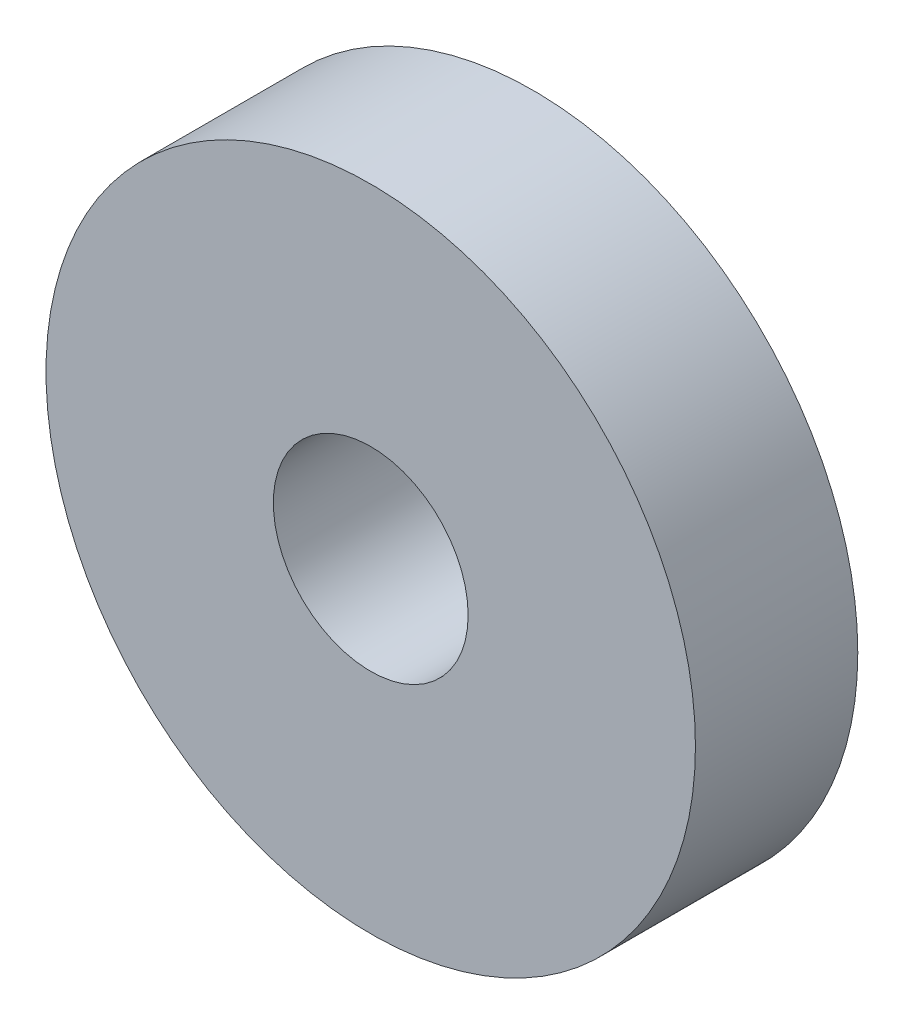
ISO-10303-21;
HEADER;
FILE_DESCRIPTION(('STEP AP214'),'2;1');
FILE_NAME('part.step','',(''),(''),'','','');
FILE_SCHEMA(('AUTOMOTIVE_DESIGN { 1 0 10303 214 1 1 1 1 }'));
ENDSEC;
DATA;
#1=APPLICATION_CONTEXT('core data for automotive mechanical design processes');
#2=APPLICATION_PROTOCOL_DEFINITION('international standard','automotive_design',2000,#1);
#3=PRODUCT_CONTEXT('',#1,'mechanical');
#4=PRODUCT('Part','Part','',(#3));
#5=PRODUCT_RELATED_PRODUCT_CATEGORY('part','',(#4));
#6=PRODUCT_DEFINITION_FORMATION('','',#4);
#7=PRODUCT_DEFINITION_CONTEXT('part definition',#1,'design');
#8=PRODUCT_DEFINITION('design','',#6,#7);
#9=PRODUCT_DEFINITION_SHAPE('','',#8);
#10=(LENGTH_UNIT() NAMED_UNIT(*) SI_UNIT(.MILLI.,.METRE.));
#11=(NAMED_UNIT(*) PLANE_ANGLE_UNIT() SI_UNIT($,.RADIAN.));
#12=(NAMED_UNIT(*) SI_UNIT($,.STERADIAN.) SOLID_ANGLE_UNIT());
#13=UNCERTAINTY_MEASURE_WITH_UNIT(LENGTH_MEASURE(1.E-05),#10,'distance_accuracy_value','');
#14=(GEOMETRIC_REPRESENTATION_CONTEXT(3) GLOBAL_UNCERTAINTY_ASSIGNED_CONTEXT((#13)) GLOBAL_UNIT_ASSIGNED_CONTEXT((#10,
#11,#12)) REPRESENTATION_CONTEXT('',''));
#15=CARTESIAN_POINT('',(0.,0.,0.));
#16=DIRECTION('',(0.,0.,1.));
#17=DIRECTION('',(1.,0.,0.));
#18=AXIS2_PLACEMENT_3D('',#15,#16,#17);
#19=CARTESIAN_POINT('',(0.,0.,5.));
#20=DIRECTION('',(0.,0.,-1.));
#21=DIRECTION('',(-1.,0.,0.));
#22=AXIS2_PLACEMENT_3D('',#19,#20,#21);
#23=CYLINDRICAL_SURFACE('',#22,10.);
#24=CARTESIAN_POINT('',(0.,0.,5.));
#25=DIRECTION('',(0.,0.,1.));
#26=DIRECTION('',(1.,0.,0.));
#27=AXIS2_PLACEMENT_3D('',#24,#25,#26);
#28=CIRCLE('',#27,10.);
#29=CARTESIAN_POINT('',(10.,0.,5.));
#30=VERTEX_POINT('',#29);
#31=EDGE_CURVE('E10',#30,#30,#28,.T.);
#32=ORIENTED_EDGE('',*,*,#31,.F.);
#33=EDGE_LOOP('',(#32));
#34=FACE_BOUND('',#33,.T.);
#35=CARTESIAN_POINT('',(0.,0.,0.));
#36=DIRECTION('',(0.,0.,1.));
#37=DIRECTION('',(1.,0.,0.));
#38=AXIS2_PLACEMENT_3D('',#35,#36,#37);
#39=CIRCLE('',#38,10.);
#40=CARTESIAN_POINT('',(10.,0.,0.));
#41=VERTEX_POINT('',#40);
#42=EDGE_CURVE('E34',#41,#41,#39,.T.);
#43=ORIENTED_EDGE('',*,*,#42,.T.);
#44=EDGE_LOOP('',(#43));
#45=FACE_BOUND('',#44,.T.);
#46=ADVANCED_FACE('F31',(#34,#45),#23,.T.);
#47=CARTESIAN_POINT('',(0.,0.,5.));
#48=DIRECTION('',(0.,0.,1.));
#49=DIRECTION('',(1.,0.,0.));
#50=AXIS2_PLACEMENT_3D('',#47,#48,#49);
#51=PLANE('',#50);
#52=CARTESIAN_POINT('',(0.,0.,5.));
#53=DIRECTION('',(0.,0.,1.));
#54=DIRECTION('',(1.,0.,0.));
#55=AXIS2_PLACEMENT_3D('',#52,#53,#54);
#56=CIRCLE('',#55,3.);
#57=CARTESIAN_POINT('',(3.,0.,5.));
#58=VERTEX_POINT('',#57);
#59=EDGE_CURVE('E43',#58,#58,#56,.T.);
#60=ORIENTED_EDGE('',*,*,#59,.F.);
#61=EDGE_LOOP('',(#60));
#62=FACE_BOUND('',#61,.T.);
#63=ORIENTED_EDGE('',*,*,#31,.T.);
#64=EDGE_LOOP('',(#63));
#65=FACE_BOUND('',#64,.T.);
#66=ADVANCED_FACE('F58',(#62,#65),#51,.T.);
#67=CARTESIAN_POINT('',(0.,0.,0.));
#68=DIRECTION('',(0.,0.,1.));
#69=DIRECTION('',(1.,0.,0.));
#70=AXIS2_PLACEMENT_3D('',#67,#68,#69);
#71=PLANE('',#70);
#72=CARTESIAN_POINT('',(0.,0.,0.));
#73=DIRECTION('',(0.,0.,1.));
#74=DIRECTION('',(1.,0.,0.));
#75=AXIS2_PLACEMENT_3D('',#72,#73,#74);
#76=CIRCLE('',#75,3.);
#77=CARTESIAN_POINT('',(3.,0.,0.));
#78=VERTEX_POINT('',#77);
#79=EDGE_CURVE('E41',#78,#78,#76,.T.);
#80=ORIENTED_EDGE('',*,*,#79,.T.);
#81=EDGE_LOOP('',(#80));
#82=FACE_BOUND('',#81,.T.);
#83=ORIENTED_EDGE('',*,*,#42,.F.);
#84=EDGE_LOOP('',(#83));
#85=FACE_BOUND('',#84,.T.);
#86=ADVANCED_FACE('F49',(#82,#85),#71,.F.);
#87=CARTESIAN_POINT('',(0.,0.,0.));
#88=DIRECTION('',(0.,0.,1.));
#89=DIRECTION('',(1.,0.,0.));
#90=AXIS2_PLACEMENT_3D('',#87,#88,#89);
#91=CYLINDRICAL_SURFACE('',#90,3.);
#92=ORIENTED_EDGE('',*,*,#79,.F.);
#93=EDGE_LOOP('',(#92));
#94=FACE_BOUND('',#93,.T.);
#95=ORIENTED_EDGE('',*,*,#59,.T.);
#96=EDGE_LOOP('',(#95));
#97=FACE_BOUND('',#96,.T.);
#98=ADVANCED_FACE('F52',(#94,#97),#91,.F.);
#99=CLOSED_SHELL('',(#46,#66,#86,#98));
#100=MANIFOLD_SOLID_BREP('B2',#99);
#101=ADVANCED_BREP_SHAPE_REPRESENTATION('',(#18,#100),#14);
#102=SHAPE_DEFINITION_REPRESENTATION(#9,#101);
ENDSEC;
END-ISO-10303-21;
